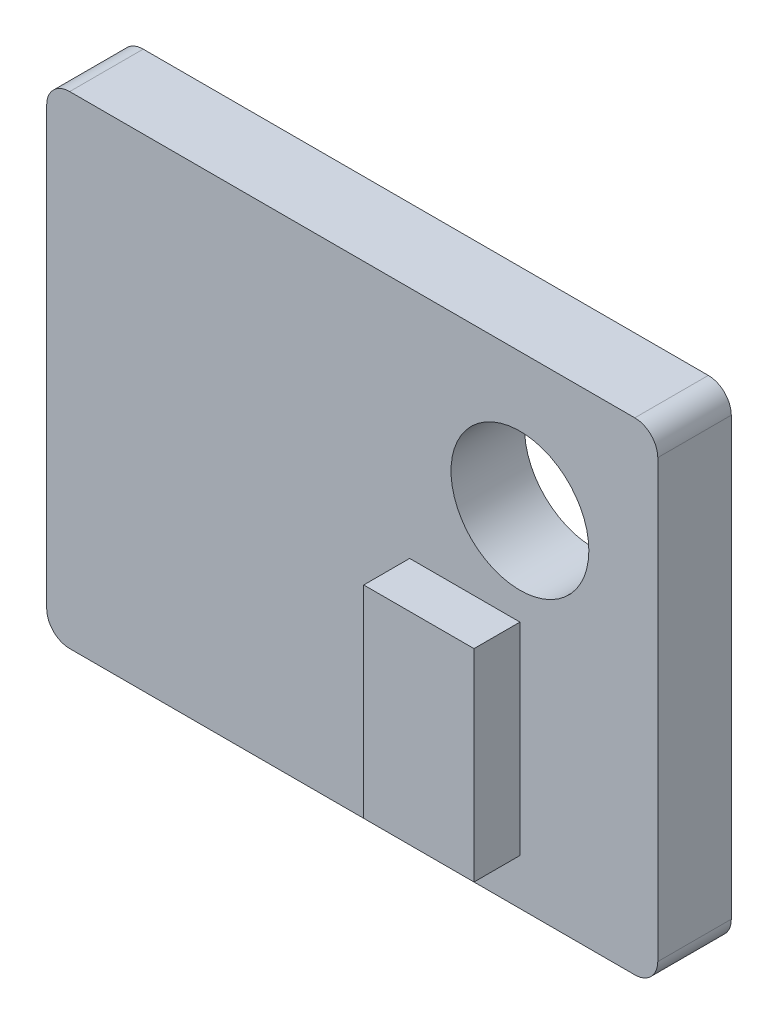
ISO-10303-21;
HEADER;
FILE_DESCRIPTION(('STEP AP214'),'2;1');
FILE_NAME('part.step','',(''),(''),'','','');
FILE_SCHEMA(('AUTOMOTIVE_DESIGN { 1 0 10303 214 1 1 1 1 }'));
ENDSEC;
DATA;
#1=APPLICATION_CONTEXT('core data for automotive mechanical design processes');
#2=APPLICATION_PROTOCOL_DEFINITION('international standard','automotive_design',2000,#1);
#3=PRODUCT_CONTEXT('',#1,'mechanical');
#4=PRODUCT('Part','Part','',(#3));
#5=PRODUCT_RELATED_PRODUCT_CATEGORY('part','',(#4));
#6=PRODUCT_DEFINITION_FORMATION('','',#4);
#7=PRODUCT_DEFINITION_CONTEXT('part definition',#1,'design');
#8=PRODUCT_DEFINITION('design','',#6,#7);
#9=PRODUCT_DEFINITION_SHAPE('','',#8);
#10=(LENGTH_UNIT() NAMED_UNIT(*) SI_UNIT(.MILLI.,.METRE.));
#11=(NAMED_UNIT(*) PLANE_ANGLE_UNIT() SI_UNIT($,.RADIAN.));
#12=(NAMED_UNIT(*) SI_UNIT($,.STERADIAN.) SOLID_ANGLE_UNIT());
#13=UNCERTAINTY_MEASURE_WITH_UNIT(LENGTH_MEASURE(1.E-05),#10,'distance_accuracy_value','');
#14=(GEOMETRIC_REPRESENTATION_CONTEXT(3) GLOBAL_UNCERTAINTY_ASSIGNED_CONTEXT((#13)) GLOBAL_UNIT_ASSIGNED_CONTEXT((#10,
#11,#12)) REPRESENTATION_CONTEXT('',''));
#15=CARTESIAN_POINT('',(0.,0.,0.));
#16=DIRECTION('',(0.,0.,1.));
#17=DIRECTION('',(1.,0.,0.));
#18=AXIS2_PLACEMENT_3D('',#15,#16,#17);
#19=CARTESIAN_POINT('',(0.,0.,1.6));
#20=DIRECTION('',(0.,0.,1.));
#21=DIRECTION('',(1.,0.,0.));
#22=AXIS2_PLACEMENT_3D('',#19,#20,#21);
#23=PLANE('',#22);
#24=DIRECTION('',(0.,-1.,0.));
#25=VECTOR('',#24,1.);
#26=CARTESIAN_POINT('',(-6.65,-5.25,1.6));
#27=LINE('',#26,#25);
#28=CARTESIAN_POINT('',(-6.65,4.74999999999999,1.6));
#29=VERTEX_POINT('',#28);
#30=CARTESIAN_POINT('',(-6.65,-4.75,1.6));
#31=VERTEX_POINT('',#30);
#32=EDGE_CURVE('E163',#29,#31,#27,.T.);
#33=ORIENTED_EDGE('',*,*,#32,.T.);
#34=CARTESIAN_POINT('',(-6.15,-4.75,1.6));
#35=DIRECTION('',(0.,0.,1.));
#36=DIRECTION('',(1.,0.,0.));
#37=AXIS2_PLACEMENT_3D('',#34,#35,#36);
#38=CIRCLE('',#37,0.5);
#39=CARTESIAN_POINT('',(-6.15,-5.25,1.6));
#40=VERTEX_POINT('',#39);
#41=EDGE_CURVE('E206',#31,#40,#38,.T.);
#42=ORIENTED_EDGE('',*,*,#41,.T.);
#43=DIRECTION('',(1.,0.,0.));
#44=VECTOR('',#43,1.);
#45=CARTESIAN_POINT('',(6.65,-5.25,1.6));
#46=LINE('',#45,#44);
#47=CARTESIAN_POINT('',(6.15,-5.25,1.6));
#48=VERTEX_POINT('',#47);
#49=EDGE_CURVE('E166',#40,#48,#46,.T.);
#50=ORIENTED_EDGE('',*,*,#49,.T.);
#51=CARTESIAN_POINT('',(6.15,-4.75,1.6));
#52=DIRECTION('',(0.,0.,1.));
#53=DIRECTION('',(1.,0.,0.));
#54=AXIS2_PLACEMENT_3D('',#51,#52,#53);
#55=CIRCLE('',#54,0.5);
#56=CARTESIAN_POINT('',(6.65,-4.75,1.6));
#57=VERTEX_POINT('',#56);
#58=EDGE_CURVE('E202',#48,#57,#55,.T.);
#59=ORIENTED_EDGE('',*,*,#58,.T.);
#60=DIRECTION('',(0.,1.,0.));
#61=VECTOR('',#60,1.);
#62=CARTESIAN_POINT('',(6.65,-5.25,1.6));
#63=LINE('',#62,#61);
#64=CARTESIAN_POINT('',(6.65,4.75,1.6));
#65=VERTEX_POINT('',#64);
#66=EDGE_CURVE('E170',#57,#65,#63,.T.);
#67=ORIENTED_EDGE('',*,*,#66,.T.);
#68=CARTESIAN_POINT('',(6.15,4.75,1.6));
#69=DIRECTION('',(0.,0.,1.));
#70=DIRECTION('',(1.,0.,0.));
#71=AXIS2_PLACEMENT_3D('',#68,#69,#70);
#72=CIRCLE('',#71,0.5);
#73=CARTESIAN_POINT('',(6.15,5.25,1.6));
#74=VERTEX_POINT('',#73);
#75=EDGE_CURVE('E57',#65,#74,#72,.T.);
#76=ORIENTED_EDGE('',*,*,#75,.T.);
#77=DIRECTION('',(-1.,0.,0.));
#78=VECTOR('',#77,1.);
#79=CARTESIAN_POINT('',(6.65,5.25,1.6));
#80=LINE('',#79,#78);
#81=CARTESIAN_POINT('',(-6.15,5.25,1.6));
#82=VERTEX_POINT('',#81);
#83=EDGE_CURVE('E172',#74,#82,#80,.T.);
#84=ORIENTED_EDGE('',*,*,#83,.T.);
#85=CARTESIAN_POINT('',(-6.15,4.75,1.6));
#86=DIRECTION('',(0.,0.,1.));
#87=DIRECTION('',(1.,0.,0.));
#88=AXIS2_PLACEMENT_3D('',#85,#86,#87);
#89=CIRCLE('',#88,0.5);
#90=EDGE_CURVE('E204',#82,#29,#89,.T.);
#91=ORIENTED_EDGE('',*,*,#90,.T.);
#92=EDGE_LOOP('',(#33,#42,#50,#59,#67,#76,#84,#91));
#93=FACE_BOUND('',#92,.T.);
#94=CARTESIAN_POINT('',(3.65,2.25,1.6));
#95=DIRECTION('',(0.,0.,1.));
#96=DIRECTION('',(1.,0.,0.));
#97=AXIS2_PLACEMENT_3D('',#94,#95,#96);
#98=CIRCLE('',#97,1.5);
#99=CARTESIAN_POINT('',(5.15,2.25,1.6));
#100=VERTEX_POINT('',#99);
#101=EDGE_CURVE('E151',#100,#100,#98,.T.);
#102=ORIENTED_EDGE('',*,*,#101,.F.);
#103=EDGE_LOOP('',(#102));
#104=FACE_BOUND('',#103,.T.);
#105=DIRECTION('',(-1.,0.,0.));
#106=VECTOR('',#105,1.);
#107=CARTESIAN_POINT('',(1.25,0.149999999999998,1.6));
#108=LINE('',#107,#106);
#109=CARTESIAN_POINT('',(3.65,0.149999999999998,1.6));
#110=VERTEX_POINT('',#109);
#111=CARTESIAN_POINT('',(1.25,0.149999999999998,1.6));
#112=VERTEX_POINT('',#111);
#113=EDGE_CURVE('E299',#110,#112,#108,.T.);
#114=ORIENTED_EDGE('',*,*,#113,.F.);
#115=DIRECTION('',(0.,1.,0.));
#116=VECTOR('',#115,1.);
#117=CARTESIAN_POINT('',(3.65,0.149999999999998,1.6));
#118=LINE('',#117,#116);
#119=CARTESIAN_POINT('',(3.65,-4.25,1.6));
#120=VERTEX_POINT('',#119);
#121=EDGE_CURVE('E149',#120,#110,#118,.T.);
#122=ORIENTED_EDGE('',*,*,#121,.F.);
#123=DIRECTION('',(1.,0.,0.));
#124=VECTOR('',#123,1.);
#125=CARTESIAN_POINT('',(1.25,-4.25,1.6));
#126=LINE('',#125,#124);
#127=CARTESIAN_POINT('',(1.25,-4.25,1.6));
#128=VERTEX_POINT('',#127);
#129=EDGE_CURVE('E145',#128,#120,#126,.T.);
#130=ORIENTED_EDGE('',*,*,#129,.F.);
#131=DIRECTION('',(0.,-1.,0.));
#132=VECTOR('',#131,1.);
#133=CARTESIAN_POINT('',(1.25,0.149999999999998,1.6));
#134=LINE('',#133,#132);
#135=EDGE_CURVE('E302',#112,#128,#134,.T.);
#136=ORIENTED_EDGE('',*,*,#135,.F.);
#137=EDGE_LOOP('',(#114,#122,#130,#136));
#138=FACE_BOUND('',#137,.T.);
#139=ADVANCED_FACE('F35',(#93,#104,#138),#23,.T.);
#140=CARTESIAN_POINT('',(-6.65,-5.25,1.6));
#141=DIRECTION('',(1.,0.,0.));
#142=DIRECTION('',(0.,0.,-1.));
#143=AXIS2_PLACEMENT_3D('',#140,#141,#142);
#144=PLANE('',#143);
#145=DIRECTION('',(0.,-1.,0.));
#146=VECTOR('',#145,1.);
#147=CARTESIAN_POINT('',(-6.65,-5.25,0.));
#148=LINE('',#147,#146);
#149=CARTESIAN_POINT('',(-6.65,4.74999999999999,0.));
#150=VERTEX_POINT('',#149);
#151=CARTESIAN_POINT('',(-6.65,-4.75,0.));
#152=VERTEX_POINT('',#151);
#153=EDGE_CURVE('E161',#150,#152,#148,.T.);
#154=ORIENTED_EDGE('',*,*,#153,.T.);
#155=DIRECTION('',(0.,0.,-1.));
#156=VECTOR('',#155,1.);
#157=CARTESIAN_POINT('',(-6.65,-4.75,1.6));
#158=LINE('',#157,#156);
#159=EDGE_CURVE('E199',#152,#31,#158,.F.);
#160=ORIENTED_EDGE('',*,*,#159,.T.);
#161=ORIENTED_EDGE('',*,*,#32,.F.);
#162=DIRECTION('',(0.,0.,-1.));
#163=VECTOR('',#162,1.);
#164=CARTESIAN_POINT('',(-6.65,4.75,1.6));
#165=LINE('',#164,#163);
#166=EDGE_CURVE('E196',#29,#150,#165,.T.);
#167=ORIENTED_EDGE('',*,*,#166,.T.);
#168=EDGE_LOOP('',(#154,#160,#161,#167));
#169=FACE_BOUND('',#168,.T.);
#170=ADVANCED_FACE('F233',(#169),#144,.F.);
#171=CARTESIAN_POINT('',(6.65,-5.25,1.6));
#172=DIRECTION('',(0.,1.,0.));
#173=DIRECTION('',(-1.,0.,0.));
#174=AXIS2_PLACEMENT_3D('',#171,#172,#173);
#175=PLANE('',#174);
#176=ORIENTED_EDGE('',*,*,#49,.F.);
#177=DIRECTION('',(0.,0.,-1.));
#178=VECTOR('',#177,1.);
#179=CARTESIAN_POINT('',(-6.15,-5.25,1.6));
#180=LINE('',#179,#178);
#181=CARTESIAN_POINT('',(-6.15,-5.25,0.));
#182=VERTEX_POINT('',#181);
#183=EDGE_CURVE('E185',#40,#182,#180,.T.);
#184=ORIENTED_EDGE('',*,*,#183,.T.);
#185=DIRECTION('',(1.,0.,0.));
#186=VECTOR('',#185,1.);
#187=CARTESIAN_POINT('',(6.65,-5.25,0.));
#188=LINE('',#187,#186);
#189=CARTESIAN_POINT('',(6.15,-5.25,0.));
#190=VERTEX_POINT('',#189);
#191=EDGE_CURVE('E177',#182,#190,#188,.T.);
#192=ORIENTED_EDGE('',*,*,#191,.T.);
#193=DIRECTION('',(0.,0.,-1.));
#194=VECTOR('',#193,1.);
#195=CARTESIAN_POINT('',(6.15,-5.25,1.6));
#196=LINE('',#195,#194);
#197=EDGE_CURVE('E174',#190,#48,#196,.F.);
#198=ORIENTED_EDGE('',*,*,#197,.T.);
#199=EDGE_LOOP('',(#176,#184,#192,#198));
#200=FACE_BOUND('',#199,.T.);
#201=ADVANCED_FACE('F241',(#200),#175,.F.);
#202=CARTESIAN_POINT('',(6.65,-5.25,1.6));
#203=DIRECTION('',(-1.,0.,0.));
#204=DIRECTION('',(0.,0.,1.));
#205=AXIS2_PLACEMENT_3D('',#202,#203,#204);
#206=PLANE('',#205);
#207=ORIENTED_EDGE('',*,*,#66,.F.);
#208=DIRECTION('',(0.,0.,-1.));
#209=VECTOR('',#208,1.);
#210=CARTESIAN_POINT('',(6.65,-4.75,1.6));
#211=LINE('',#210,#209);
#212=CARTESIAN_POINT('',(6.65,-4.75,0.));
#213=VERTEX_POINT('',#212);
#214=EDGE_CURVE('E11',#57,#213,#211,.T.);
#215=ORIENTED_EDGE('',*,*,#214,.T.);
#216=DIRECTION('',(0.,1.,0.));
#217=VECTOR('',#216,1.);
#218=CARTESIAN_POINT('',(6.65,-5.25,0.));
#219=LINE('',#218,#217);
#220=CARTESIAN_POINT('',(6.65,4.75,0.));
#221=VERTEX_POINT('',#220);
#222=EDGE_CURVE('E180',#213,#221,#219,.T.);
#223=ORIENTED_EDGE('',*,*,#222,.T.);
#224=DIRECTION('',(0.,0.,-1.));
#225=VECTOR('',#224,1.);
#226=CARTESIAN_POINT('',(6.65,4.75,1.6));
#227=LINE('',#226,#225);
#228=EDGE_CURVE('E43',#221,#65,#227,.F.);
#229=ORIENTED_EDGE('',*,*,#228,.T.);
#230=EDGE_LOOP('',(#207,#215,#223,#229));
#231=FACE_BOUND('',#230,.T.);
#232=ADVANCED_FACE('F214',(#231),#206,.F.);
#233=CARTESIAN_POINT('',(6.65,5.25,1.6));
#234=DIRECTION('',(0.,-1.,0.));
#235=DIRECTION('',(1.,0.,0.));
#236=AXIS2_PLACEMENT_3D('',#233,#234,#235);
#237=PLANE('',#236);
#238=DIRECTION('',(-1.,0.,0.));
#239=VECTOR('',#238,1.);
#240=CARTESIAN_POINT('',(6.65,5.25,0.));
#241=LINE('',#240,#239);
#242=CARTESIAN_POINT('',(6.15,5.25,0.));
#243=VERTEX_POINT('',#242);
#244=CARTESIAN_POINT('',(-6.15,5.25,0.));
#245=VERTEX_POINT('',#244);
#246=EDGE_CURVE('E167',#243,#245,#241,.T.);
#247=ORIENTED_EDGE('',*,*,#246,.T.);
#248=DIRECTION('',(0.,0.,-1.));
#249=VECTOR('',#248,1.);
#250=CARTESIAN_POINT('',(-6.15,5.25,1.6));
#251=LINE('',#250,#249);
#252=EDGE_CURVE('E50',#245,#82,#251,.F.);
#253=ORIENTED_EDGE('',*,*,#252,.T.);
#254=ORIENTED_EDGE('',*,*,#83,.F.);
#255=DIRECTION('',(0.,0.,-1.));
#256=VECTOR('',#255,1.);
#257=CARTESIAN_POINT('',(6.15,5.25,1.6));
#258=LINE('',#257,#256);
#259=EDGE_CURVE('E208',#74,#243,#258,.T.);
#260=ORIENTED_EDGE('',*,*,#259,.T.);
#261=EDGE_LOOP('',(#247,#253,#254,#260));
#262=FACE_BOUND('',#261,.T.);
#263=ADVANCED_FACE('F222',(#262),#237,.F.);
#264=CARTESIAN_POINT('',(0.,0.,0.));
#265=DIRECTION('',(0.,0.,1.));
#266=DIRECTION('',(1.,0.,0.));
#267=AXIS2_PLACEMENT_3D('',#264,#265,#266);
#268=PLANE('',#267);
#269=CARTESIAN_POINT('',(3.65,2.25,0.));
#270=DIRECTION('',(0.,0.,1.));
#271=DIRECTION('',(1.,0.,0.));
#272=AXIS2_PLACEMENT_3D('',#269,#270,#271);
#273=CIRCLE('',#272,1.5);
#274=CARTESIAN_POINT('',(5.15,2.25,0.));
#275=VERTEX_POINT('',#274);
#276=EDGE_CURVE('E154',#275,#275,#273,.T.);
#277=ORIENTED_EDGE('',*,*,#276,.T.);
#278=EDGE_LOOP('',(#277));
#279=FACE_BOUND('',#278,.T.);
#280=ORIENTED_EDGE('',*,*,#191,.F.);
#281=CARTESIAN_POINT('',(-6.15,-4.75,0.));
#282=DIRECTION('',(0.,0.,1.));
#283=DIRECTION('',(1.,0.,0.));
#284=AXIS2_PLACEMENT_3D('',#281,#282,#283);
#285=CIRCLE('',#284,0.5);
#286=EDGE_CURVE('E194',#182,#152,#285,.F.);
#287=ORIENTED_EDGE('',*,*,#286,.T.);
#288=ORIENTED_EDGE('',*,*,#153,.F.);
#289=CARTESIAN_POINT('',(-6.15,4.75,0.));
#290=DIRECTION('',(0.,0.,1.));
#291=DIRECTION('',(1.,0.,0.));
#292=AXIS2_PLACEMENT_3D('',#289,#290,#291);
#293=CIRCLE('',#292,0.5);
#294=EDGE_CURVE('E192',#150,#245,#293,.F.);
#295=ORIENTED_EDGE('',*,*,#294,.T.);
#296=ORIENTED_EDGE('',*,*,#246,.F.);
#297=CARTESIAN_POINT('',(6.15,4.75,0.));
#298=DIRECTION('',(0.,0.,1.));
#299=DIRECTION('',(1.,0.,0.));
#300=AXIS2_PLACEMENT_3D('',#297,#298,#299);
#301=CIRCLE('',#300,0.5);
#302=EDGE_CURVE('E188',#243,#221,#301,.F.);
#303=ORIENTED_EDGE('',*,*,#302,.T.);
#304=ORIENTED_EDGE('',*,*,#222,.F.);
#305=CARTESIAN_POINT('',(6.15,-4.75,0.));
#306=DIRECTION('',(0.,0.,1.));
#307=DIRECTION('',(1.,0.,0.));
#308=AXIS2_PLACEMENT_3D('',#305,#306,#307);
#309=CIRCLE('',#308,0.5);
#310=EDGE_CURVE('E190',#213,#190,#309,.F.);
#311=ORIENTED_EDGE('',*,*,#310,.T.);
#312=EDGE_LOOP('',(#280,#287,#288,#295,#296,#303,#304,#311));
#313=FACE_BOUND('',#312,.T.);
#314=ADVANCED_FACE('F225',(#279,#313),#268,.F.);
#315=CARTESIAN_POINT('',(3.65,2.25,0.));
#316=DIRECTION('',(0.,0.,1.));
#317=DIRECTION('',(1.,0.,0.));
#318=AXIS2_PLACEMENT_3D('',#315,#316,#317);
#319=CYLINDRICAL_SURFACE('',#318,1.5);
#320=ORIENTED_EDGE('',*,*,#276,.F.);
#321=EDGE_LOOP('',(#320));
#322=FACE_BOUND('',#321,.T.);
#323=ORIENTED_EDGE('',*,*,#101,.T.);
#324=EDGE_LOOP('',(#323));
#325=FACE_BOUND('',#324,.T.);
#326=ADVANCED_FACE('F259',(#322,#325),#319,.F.);
#327=CARTESIAN_POINT('',(3.65,0.149999999999998,2.6));
#328=DIRECTION('',(-1.,0.,0.));
#329=DIRECTION('',(0.,-1.,0.));
#330=AXIS2_PLACEMENT_3D('',#327,#328,#329);
#331=PLANE('',#330);
#332=ORIENTED_EDGE('',*,*,#121,.T.);
#333=DIRECTION('',(0.,0.,-1.));
#334=VECTOR('',#333,1.);
#335=CARTESIAN_POINT('',(3.65,0.149999999999998,2.6));
#336=LINE('',#335,#334);
#337=CARTESIAN_POINT('',(3.65,0.149999999999998,2.6));
#338=VERTEX_POINT('',#337);
#339=EDGE_CURVE('E129',#338,#110,#336,.T.);
#340=ORIENTED_EDGE('',*,*,#339,.F.);
#341=DIRECTION('',(0.,1.,0.));
#342=VECTOR('',#341,1.);
#343=CARTESIAN_POINT('',(3.65,0.149999999999998,2.6));
#344=LINE('',#343,#342);
#345=CARTESIAN_POINT('',(3.65,-4.25,2.6));
#346=VERTEX_POINT('',#345);
#347=EDGE_CURVE('E136',#346,#338,#344,.T.);
#348=ORIENTED_EDGE('',*,*,#347,.F.);
#349=DIRECTION('',(0.,0.,-1.));
#350=VECTOR('',#349,1.);
#351=CARTESIAN_POINT('',(3.65,-4.25,2.6));
#352=LINE('',#351,#350);
#353=EDGE_CURVE('E309',#346,#120,#352,.T.);
#354=ORIENTED_EDGE('',*,*,#353,.T.);
#355=EDGE_LOOP('',(#332,#340,#348,#354));
#356=FACE_BOUND('',#355,.T.);
#357=ADVANCED_FACE('F147',(#356),#331,.F.);
#358=CARTESIAN_POINT('',(1.25,0.149999999999998,2.6));
#359=DIRECTION('',(0.,-1.,0.));
#360=DIRECTION('',(0.,0.,-1.));
#361=AXIS2_PLACEMENT_3D('',#358,#359,#360);
#362=PLANE('',#361);
#363=ORIENTED_EDGE('',*,*,#113,.T.);
#364=DIRECTION('',(0.,0.,-1.));
#365=VECTOR('',#364,1.);
#366=CARTESIAN_POINT('',(1.25,0.149999999999998,2.6));
#367=LINE('',#366,#365);
#368=CARTESIAN_POINT('',(1.25,0.149999999999998,2.6));
#369=VERTEX_POINT('',#368);
#370=EDGE_CURVE('E132',#369,#112,#367,.T.);
#371=ORIENTED_EDGE('',*,*,#370,.F.);
#372=DIRECTION('',(-1.,0.,0.));
#373=VECTOR('',#372,1.);
#374=CARTESIAN_POINT('',(1.25,0.149999999999998,2.6));
#375=LINE('',#374,#373);
#376=EDGE_CURVE('E125',#338,#369,#375,.T.);
#377=ORIENTED_EDGE('',*,*,#376,.F.);
#378=ORIENTED_EDGE('',*,*,#339,.T.);
#379=EDGE_LOOP('',(#363,#371,#377,#378));
#380=FACE_BOUND('',#379,.T.);
#381=ADVANCED_FACE('F127',(#380),#362,.F.);
#382=CARTESIAN_POINT('',(1.25,0.149999999999998,2.6));
#383=DIRECTION('',(1.,0.,0.));
#384=DIRECTION('',(0.,1.,0.));
#385=AXIS2_PLACEMENT_3D('',#382,#383,#384);
#386=PLANE('',#385);
#387=ORIENTED_EDGE('',*,*,#135,.T.);
#388=DIRECTION('',(0.,0.,-1.));
#389=VECTOR('',#388,1.);
#390=CARTESIAN_POINT('',(1.25,-4.25,2.6));
#391=LINE('',#390,#389);
#392=CARTESIAN_POINT('',(1.25,-4.25,2.6));
#393=VERTEX_POINT('',#392);
#394=EDGE_CURVE('E156',#393,#128,#391,.T.);
#395=ORIENTED_EDGE('',*,*,#394,.F.);
#396=DIRECTION('',(0.,-1.,0.));
#397=VECTOR('',#396,1.);
#398=CARTESIAN_POINT('',(1.25,0.149999999999998,2.6));
#399=LINE('',#398,#397);
#400=EDGE_CURVE('E135',#369,#393,#399,.T.);
#401=ORIENTED_EDGE('',*,*,#400,.F.);
#402=ORIENTED_EDGE('',*,*,#370,.T.);
#403=EDGE_LOOP('',(#387,#395,#401,#402));
#404=FACE_BOUND('',#403,.T.);
#405=ADVANCED_FACE('F279',(#404),#386,.F.);
#406=CARTESIAN_POINT('',(1.25,-4.25,2.6));
#407=DIRECTION('',(0.,1.,0.));
#408=DIRECTION('',(0.,0.,1.));
#409=AXIS2_PLACEMENT_3D('',#406,#407,#408);
#410=PLANE('',#409);
#411=ORIENTED_EDGE('',*,*,#129,.T.);
#412=ORIENTED_EDGE('',*,*,#353,.F.);
#413=DIRECTION('',(1.,0.,0.));
#414=VECTOR('',#413,1.);
#415=CARTESIAN_POINT('',(1.25,-4.25,2.6));
#416=LINE('',#415,#414);
#417=EDGE_CURVE('E141',#393,#346,#416,.T.);
#418=ORIENTED_EDGE('',*,*,#417,.F.);
#419=ORIENTED_EDGE('',*,*,#394,.T.);
#420=EDGE_LOOP('',(#411,#412,#418,#419));
#421=FACE_BOUND('',#420,.T.);
#422=ADVANCED_FACE('F274',(#421),#410,.F.);
#423=CARTESIAN_POINT('',(0.,0.,2.6));
#424=DIRECTION('',(0.,0.,1.));
#425=DIRECTION('',(1.,0.,0.));
#426=AXIS2_PLACEMENT_3D('',#423,#424,#425);
#427=PLANE('',#426);
#428=ORIENTED_EDGE('',*,*,#347,.T.);
#429=ORIENTED_EDGE('',*,*,#376,.T.);
#430=ORIENTED_EDGE('',*,*,#400,.T.);
#431=ORIENTED_EDGE('',*,*,#417,.T.);
#432=EDGE_LOOP('',(#428,#429,#430,#431));
#433=FACE_BOUND('',#432,.T.);
#434=ADVANCED_FACE('F139',(#433),#427,.T.);
#435=CARTESIAN_POINT('',(-6.15,-4.75,1.6));
#436=DIRECTION('',(0.,0.,-1.));
#437=DIRECTION('',(-1.,0.,0.));
#438=AXIS2_PLACEMENT_3D('',#435,#436,#437);
#439=CYLINDRICAL_SURFACE('',#438,0.5);
#440=ORIENTED_EDGE('',*,*,#41,.F.);
#441=ORIENTED_EDGE('',*,*,#159,.F.);
#442=ORIENTED_EDGE('',*,*,#286,.F.);
#443=ORIENTED_EDGE('',*,*,#183,.F.);
#444=EDGE_LOOP('',(#440,#441,#442,#443));
#445=FACE_BOUND('',#444,.T.);
#446=ADVANCED_FACE('F239',(#445),#439,.T.);
#447=CARTESIAN_POINT('',(-6.15,4.75,1.6));
#448=DIRECTION('',(0.,0.,-1.));
#449=DIRECTION('',(-1.,0.,0.));
#450=AXIS2_PLACEMENT_3D('',#447,#448,#449);
#451=CYLINDRICAL_SURFACE('',#450,0.5);
#452=ORIENTED_EDGE('',*,*,#90,.F.);
#453=ORIENTED_EDGE('',*,*,#252,.F.);
#454=ORIENTED_EDGE('',*,*,#294,.F.);
#455=ORIENTED_EDGE('',*,*,#166,.F.);
#456=EDGE_LOOP('',(#452,#453,#454,#455));
#457=FACE_BOUND('',#456,.T.);
#458=ADVANCED_FACE('F230',(#457),#451,.T.);
#459=CARTESIAN_POINT('',(6.15,-4.75,1.6));
#460=DIRECTION('',(0.,0.,-1.));
#461=DIRECTION('',(-1.,0.,0.));
#462=AXIS2_PLACEMENT_3D('',#459,#460,#461);
#463=CYLINDRICAL_SURFACE('',#462,0.5);
#464=ORIENTED_EDGE('',*,*,#58,.F.);
#465=ORIENTED_EDGE('',*,*,#197,.F.);
#466=ORIENTED_EDGE('',*,*,#310,.F.);
#467=ORIENTED_EDGE('',*,*,#214,.F.);
#468=EDGE_LOOP('',(#464,#465,#466,#467));
#469=FACE_BOUND('',#468,.T.);
#470=ADVANCED_FACE('F244',(#469),#463,.T.);
#471=CARTESIAN_POINT('',(6.15,4.75,1.6));
#472=DIRECTION('',(0.,0.,-1.));
#473=DIRECTION('',(-1.,0.,0.));
#474=AXIS2_PLACEMENT_3D('',#471,#472,#473);
#475=CYLINDRICAL_SURFACE('',#474,0.5);
#476=ORIENTED_EDGE('',*,*,#75,.F.);
#477=ORIENTED_EDGE('',*,*,#228,.F.);
#478=ORIENTED_EDGE('',*,*,#302,.F.);
#479=ORIENTED_EDGE('',*,*,#259,.F.);
#480=EDGE_LOOP('',(#476,#477,#478,#479));
#481=FACE_BOUND('',#480,.T.);
#482=ADVANCED_FACE('F37',(#481),#475,.T.);
#483=CLOSED_SHELL('',(#139,#170,#201,#232,#263,#314,#326,#357,#381,#405,#422,#434,#446,#458,
#470,#482));
#484=MANIFOLD_SOLID_BREP('B2',#483);
#485=ADVANCED_BREP_SHAPE_REPRESENTATION('',(#18,#484),#14);
#486=SHAPE_DEFINITION_REPRESENTATION(#9,#485);
ENDSEC;
END-ISO-10303-21;
